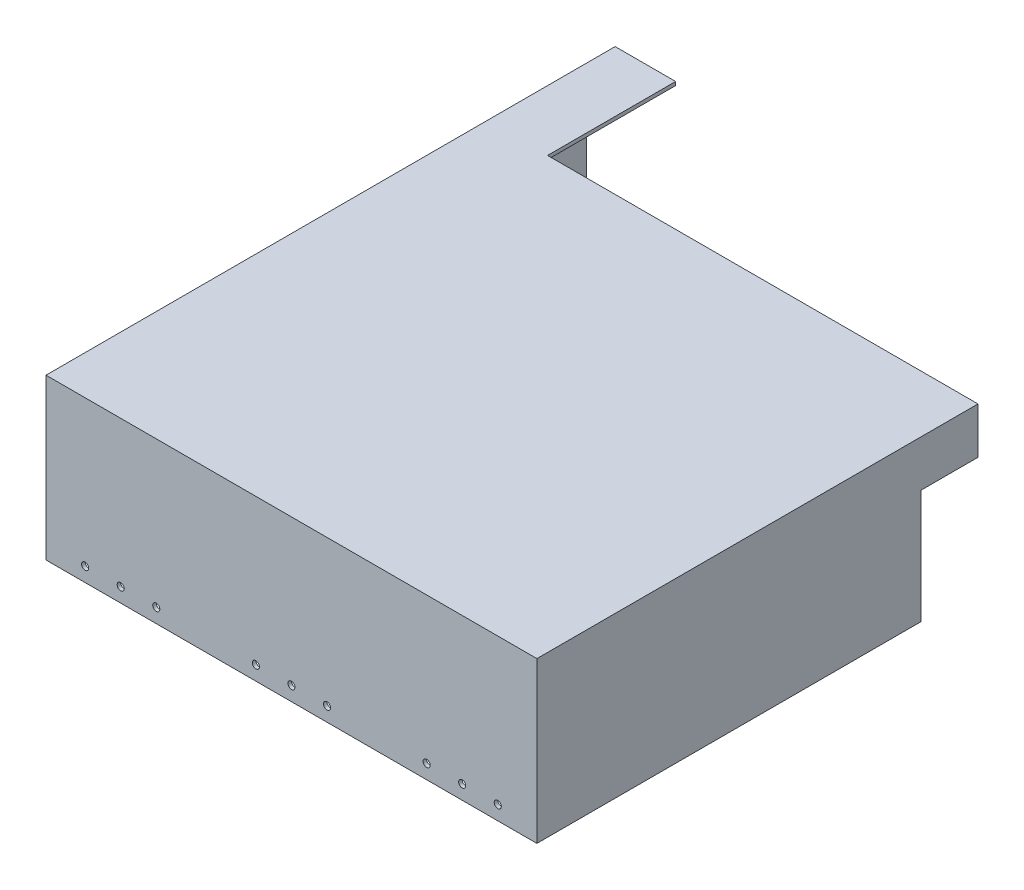
ISO-10303-21;
HEADER;
FILE_DESCRIPTION(('STEP AP214'),'2;1');
FILE_NAME('part.step','',(''),(''),'','','');
FILE_SCHEMA(('AUTOMOTIVE_DESIGN { 1 0 10303 214 1 1 1 1 }'));
ENDSEC;
DATA;
#1=APPLICATION_CONTEXT('core data for automotive mechanical design processes');
#2=APPLICATION_PROTOCOL_DEFINITION('international standard','automotive_design',2000,#1);
#3=PRODUCT_CONTEXT('',#1,'mechanical');
#4=PRODUCT('Part','Part','',(#3));
#5=PRODUCT_RELATED_PRODUCT_CATEGORY('part','',(#4));
#6=PRODUCT_DEFINITION_FORMATION('','',#4);
#7=PRODUCT_DEFINITION_CONTEXT('part definition',#1,'design');
#8=PRODUCT_DEFINITION('design','',#6,#7);
#9=PRODUCT_DEFINITION_SHAPE('','',#8);
#10=(LENGTH_UNIT() NAMED_UNIT(*) SI_UNIT(.MILLI.,.METRE.));
#11=(NAMED_UNIT(*) PLANE_ANGLE_UNIT() SI_UNIT($,.RADIAN.));
#12=(NAMED_UNIT(*) SI_UNIT($,.STERADIAN.) SOLID_ANGLE_UNIT());
#13=UNCERTAINTY_MEASURE_WITH_UNIT(LENGTH_MEASURE(1.E-05),#10,'distance_accuracy_value','');
#14=(GEOMETRIC_REPRESENTATION_CONTEXT(3) GLOBAL_UNCERTAINTY_ASSIGNED_CONTEXT((#13)) GLOBAL_UNIT_ASSIGNED_CONTEXT((#10,
#11,#12)) REPRESENTATION_CONTEXT('',''));
#15=CARTESIAN_POINT('',(0.,0.,0.));
#16=DIRECTION('',(0.,0.,1.));
#17=DIRECTION('',(1.,0.,0.));
#18=AXIS2_PLACEMENT_3D('',#15,#16,#17);
#19=CARTESIAN_POINT('',(3.175,0.,508.));
#20=DIRECTION('',(-1.,0.,0.));
#21=DIRECTION('',(0.,0.,1.));
#22=AXIS2_PLACEMENT_3D('',#19,#20,#21);
#23=PLANE('',#22);
#24=DIRECTION('',(0.,-1.,0.));
#25=VECTOR('',#24,1.);
#26=CARTESIAN_POINT('',(3.17499999999998,0.,28.575));
#27=LINE('',#26,#25);
#28=CARTESIAN_POINT('',(3.17499999999998,117.475,28.575));
#29=VERTEX_POINT('',#28);
#30=CARTESIAN_POINT('',(3.17499999999998,0.,28.575));
#31=VERTEX_POINT('',#30);
#32=EDGE_CURVE('E145',#29,#31,#27,.T.);
#33=ORIENTED_EDGE('',*,*,#32,.F.);
#34=DIRECTION('',(0.,0.,1.));
#35=VECTOR('',#34,1.);
#36=CARTESIAN_POINT('',(3.17499999999998,117.475,0.));
#37=LINE('',#36,#35);
#38=CARTESIAN_POINT('',(3.17499999999998,117.475,0.));
#39=VERTEX_POINT('',#38);
#40=EDGE_CURVE('E156',#39,#29,#37,.T.);
#41=ORIENTED_EDGE('',*,*,#40,.F.);
#42=DIRECTION('',(0.,1.,0.));
#43=VECTOR('',#42,1.);
#44=CARTESIAN_POINT('',(3.175,0.,0.));
#45=LINE('',#44,#43);
#46=CARTESIAN_POINT('',(3.175,139.7,0.));
#47=VERTEX_POINT('',#46);
#48=EDGE_CURVE('E190',#39,#47,#45,.T.);
#49=ORIENTED_EDGE('',*,*,#48,.T.);
#50=DIRECTION('',(0.,0.,-1.));
#51=VECTOR('',#50,1.);
#52=CARTESIAN_POINT('',(3.175,139.7,508.));
#53=LINE('',#52,#51);
#54=CARTESIAN_POINT('',(3.175,139.7,504.825));
#55=VERTEX_POINT('',#54);
#56=EDGE_CURVE('E163',#55,#47,#53,.T.);
#57=ORIENTED_EDGE('',*,*,#56,.F.);
#58=DIRECTION('',(0.,1.,0.));
#59=VECTOR('',#58,1.);
#60=CARTESIAN_POINT('',(3.175,0.,504.825));
#61=LINE('',#60,#59);
#62=CARTESIAN_POINT('',(3.175,0.,504.825));
#63=VERTEX_POINT('',#62);
#64=EDGE_CURVE('E194',#63,#55,#61,.T.);
#65=ORIENTED_EDGE('',*,*,#64,.F.);
#66=DIRECTION('',(0.,0.,-1.));
#67=VECTOR('',#66,1.);
#68=CARTESIAN_POINT('',(3.175,0.,508.));
#69=LINE('',#68,#67);
#70=EDGE_CURVE('E162',#63,#31,#69,.T.);
#71=ORIENTED_EDGE('',*,*,#70,.T.);
#72=EDGE_LOOP('',(#33,#41,#49,#57,#65,#71));
#73=FACE_BOUND('',#72,.T.);
#74=ADVANCED_FACE('F39',(#73),#23,.F.);
#75=CARTESIAN_POINT('',(3.175,139.7,508.));
#76=DIRECTION('',(0.,1.,0.));
#77=DIRECTION('',(0.,0.,1.));
#78=AXIS2_PLACEMENT_3D('',#75,#76,#77);
#79=PLANE('',#78);
#80=DIRECTION('',(1.,0.,0.));
#81=VECTOR('',#80,1.);
#82=CARTESIAN_POINT('',(3.175,139.7,0.));
#83=LINE('',#82,#81);
#84=CARTESIAN_POINT('',(53.975,139.7,0.));
#85=VERTEX_POINT('',#84);
#86=EDGE_CURVE('E187',#47,#85,#83,.T.);
#87=ORIENTED_EDGE('',*,*,#86,.T.);
#88=DIRECTION('',(0.,0.,1.));
#89=VECTOR('',#88,1.);
#90=CARTESIAN_POINT('',(53.9750000000001,139.7,508.));
#91=LINE('',#90,#89);
#92=CARTESIAN_POINT('',(53.975,139.7,114.3));
#93=VERTEX_POINT('',#92);
#94=EDGE_CURVE('E214',#85,#93,#91,.T.);
#95=ORIENTED_EDGE('',*,*,#94,.T.);
#96=DIRECTION('',(1.,0.,0.));
#97=VECTOR('',#96,1.);
#98=CARTESIAN_POINT('',(3.175,139.7,114.3));
#99=LINE('',#98,#97);
#100=CARTESIAN_POINT('',(434.975,139.7,114.3));
#101=VERTEX_POINT('',#100);
#102=EDGE_CURVE('E208',#93,#101,#99,.T.);
#103=ORIENTED_EDGE('',*,*,#102,.T.);
#104=DIRECTION('',(0.,0.,-1.));
#105=VECTOR('',#104,1.);
#106=CARTESIAN_POINT('',(434.975,139.7,508.));
#107=LINE('',#106,#105);
#108=CARTESIAN_POINT('',(434.975,139.7,504.825));
#109=VERTEX_POINT('',#108);
#110=EDGE_CURVE('E168',#109,#101,#107,.T.);
#111=ORIENTED_EDGE('',*,*,#110,.F.);
#112=DIRECTION('',(1.,0.,0.));
#113=VECTOR('',#112,1.);
#114=CARTESIAN_POINT('',(3.175,139.7,504.825));
#115=LINE('',#114,#113);
#116=EDGE_CURVE('E201',#55,#109,#115,.T.);
#117=ORIENTED_EDGE('',*,*,#116,.F.);
#118=ORIENTED_EDGE('',*,*,#56,.T.);
#119=EDGE_LOOP('',(#87,#95,#103,#111,#117,#118));
#120=FACE_BOUND('',#119,.T.);
#121=ADVANCED_FACE('F329',(#120),#79,.F.);
#122=CARTESIAN_POINT('',(434.975,139.7,508.));
#123=DIRECTION('',(1.,0.,0.));
#124=DIRECTION('',(0.,1.,0.));
#125=AXIS2_PLACEMENT_3D('',#122,#123,#124);
#126=PLANE('',#125);
#127=DIRECTION('',(0.,0.,-1.));
#128=VECTOR('',#127,1.);
#129=CARTESIAN_POINT('',(434.975,101.6,114.3));
#130=LINE('',#129,#128);
#131=CARTESIAN_POINT('',(434.975,101.6,165.1));
#132=VERTEX_POINT('',#131);
#133=CARTESIAN_POINT('',(434.975,101.6,114.3));
#134=VERTEX_POINT('',#133);
#135=EDGE_CURVE('E62',#132,#134,#130,.T.);
#136=ORIENTED_EDGE('',*,*,#135,.F.);
#137=DIRECTION('',(0.,1.,0.));
#138=VECTOR('',#137,1.);
#139=CARTESIAN_POINT('',(434.975,1.66620730681001E-13,165.1));
#140=LINE('',#139,#138);
#141=CARTESIAN_POINT('',(434.975,0.,165.1));
#142=VERTEX_POINT('',#141);
#143=EDGE_CURVE('E236',#142,#132,#140,.T.);
#144=ORIENTED_EDGE('',*,*,#143,.F.);
#145=DIRECTION('',(0.,0.,-1.));
#146=VECTOR('',#145,1.);
#147=CARTESIAN_POINT('',(434.975,0.,508.));
#148=LINE('',#147,#146);
#149=CARTESIAN_POINT('',(434.975,0.,504.825));
#150=VERTEX_POINT('',#149);
#151=EDGE_CURVE('E171',#150,#142,#148,.T.);
#152=ORIENTED_EDGE('',*,*,#151,.F.);
#153=DIRECTION('',(0.,-1.,0.));
#154=VECTOR('',#153,1.);
#155=CARTESIAN_POINT('',(434.975,139.7,504.825));
#156=LINE('',#155,#154);
#157=EDGE_CURVE('E203',#109,#150,#156,.T.);
#158=ORIENTED_EDGE('',*,*,#157,.F.);
#159=ORIENTED_EDGE('',*,*,#110,.T.);
#160=DIRECTION('',(0.,-1.,0.));
#161=VECTOR('',#160,1.);
#162=CARTESIAN_POINT('',(434.975,139.7,114.3));
#163=LINE('',#162,#161);
#164=EDGE_CURVE('E211',#101,#134,#163,.T.);
#165=ORIENTED_EDGE('',*,*,#164,.T.);
#166=EDGE_LOOP('',(#136,#144,#152,#158,#159,#165));
#167=FACE_BOUND('',#166,.T.);
#168=ADVANCED_FACE('F347',(#167),#126,.F.);
#169=CARTESIAN_POINT('',(0.,142.875,508.));
#170=DIRECTION('',(1.,0.,0.));
#171=DIRECTION('',(0.,1.,0.));
#172=AXIS2_PLACEMENT_3D('',#169,#170,#171);
#173=PLANE('',#172);
#174=DIRECTION('',(0.,-1.,0.));
#175=VECTOR('',#174,1.);
#176=CARTESIAN_POINT('',(0.,142.875,0.));
#177=LINE('',#176,#175);
#178=CARTESIAN_POINT('',(0.,142.875,0.));
#179=VERTEX_POINT('',#178);
#180=CARTESIAN_POINT('',(0.,117.475,0.));
#181=VERTEX_POINT('',#180);
#182=EDGE_CURVE('E192',#179,#181,#177,.T.);
#183=ORIENTED_EDGE('',*,*,#182,.T.);
#184=DIRECTION('',(0.,0.,-1.));
#185=VECTOR('',#184,1.);
#186=CARTESIAN_POINT('',(0.,117.475,0.));
#187=LINE('',#186,#185);
#188=CARTESIAN_POINT('',(0.,117.475,28.575));
#189=VERTEX_POINT('',#188);
#190=EDGE_CURVE('E54',#189,#181,#187,.T.);
#191=ORIENTED_EDGE('',*,*,#190,.F.);
#192=DIRECTION('',(0.,1.,0.));
#193=VECTOR('',#192,1.);
#194=CARTESIAN_POINT('',(0.,0.,28.575));
#195=LINE('',#194,#193);
#196=CARTESIAN_POINT('',(0.,0.,28.575));
#197=VERTEX_POINT('',#196);
#198=EDGE_CURVE('E143',#197,#189,#195,.T.);
#199=ORIENTED_EDGE('',*,*,#198,.F.);
#200=DIRECTION('',(0.,0.,-1.));
#201=VECTOR('',#200,1.);
#202=CARTESIAN_POINT('',(0.,0.,508.));
#203=LINE('',#202,#201);
#204=CARTESIAN_POINT('',(0.,0.,508.));
#205=VERTEX_POINT('',#204);
#206=EDGE_CURVE('E47',#205,#197,#203,.T.);
#207=ORIENTED_EDGE('',*,*,#206,.F.);
#208=DIRECTION('',(0.,-1.,0.));
#209=VECTOR('',#208,1.);
#210=CARTESIAN_POINT('',(0.,142.875,508.));
#211=LINE('',#210,#209);
#212=CARTESIAN_POINT('',(0.,142.875,508.));
#213=VERTEX_POINT('',#212);
#214=EDGE_CURVE('E186',#213,#205,#211,.T.);
#215=ORIENTED_EDGE('',*,*,#214,.F.);
#216=DIRECTION('',(0.,0.,-1.));
#217=VECTOR('',#216,1.);
#218=CARTESIAN_POINT('',(0.,142.875,508.));
#219=LINE('',#218,#217);
#220=EDGE_CURVE('E180',#213,#179,#219,.T.);
#221=ORIENTED_EDGE('',*,*,#220,.T.);
#222=EDGE_LOOP('',(#183,#191,#199,#207,#215,#221));
#223=FACE_BOUND('',#222,.T.);
#224=ADVANCED_FACE('F41',(#223),#173,.F.);
#225=CARTESIAN_POINT('',(434.975,0.,508.));
#226=DIRECTION('',(0.,1.,0.));
#227=DIRECTION('',(0.,0.,1.));
#228=AXIS2_PLACEMENT_3D('',#225,#226,#227);
#229=PLANE('',#228);
#230=ORIENTED_EDGE('',*,*,#206,.T.);
#231=DIRECTION('',(-1.,0.,0.));
#232=VECTOR('',#231,1.);
#233=CARTESIAN_POINT('',(438.151,0.,28.575));
#234=LINE('',#233,#232);
#235=EDGE_CURVE('E140',#31,#197,#234,.T.);
#236=ORIENTED_EDGE('',*,*,#235,.F.);
#237=ORIENTED_EDGE('',*,*,#70,.F.);
#238=DIRECTION('',(1.,0.,0.));
#239=VECTOR('',#238,1.);
#240=CARTESIAN_POINT('',(0.,0.,504.825));
#241=LINE('',#240,#239);
#242=EDGE_CURVE('E205',#63,#150,#241,.T.);
#243=ORIENTED_EDGE('',*,*,#242,.T.);
#244=ORIENTED_EDGE('',*,*,#151,.T.);
#245=DIRECTION('',(1.,0.,0.));
#246=VECTOR('',#245,1.);
#247=CARTESIAN_POINT('',(-0.000999999999973245,0.,165.1));
#248=LINE('',#247,#246);
#249=CARTESIAN_POINT('',(438.15,0.,165.1));
#250=VERTEX_POINT('',#249);
#251=EDGE_CURVE('E229',#142,#250,#248,.T.);
#252=ORIENTED_EDGE('',*,*,#251,.T.);
#253=DIRECTION('',(0.,0.,-1.));
#254=VECTOR('',#253,1.);
#255=CARTESIAN_POINT('',(438.15,0.,508.));
#256=LINE('',#255,#254);
#257=CARTESIAN_POINT('',(438.15,0.,508.));
#258=VERTEX_POINT('',#257);
#259=EDGE_CURVE('E174',#258,#250,#256,.T.);
#260=ORIENTED_EDGE('',*,*,#259,.F.);
#261=DIRECTION('',(1.,0.,0.));
#262=VECTOR('',#261,1.);
#263=CARTESIAN_POINT('',(0.,0.,508.));
#264=LINE('',#263,#262);
#265=EDGE_CURVE('E160',#205,#258,#264,.T.);
#266=ORIENTED_EDGE('',*,*,#265,.F.);
#267=EDGE_LOOP('',(#230,#236,#237,#243,#244,#252,#260,#266));
#268=FACE_BOUND('',#267,.T.);
#269=ADVANCED_FACE('F158',(#268),#229,.F.);
#270=CARTESIAN_POINT('',(438.15,0.,508.));
#271=DIRECTION('',(-1.,0.,0.));
#272=DIRECTION('',(0.,0.,1.));
#273=AXIS2_PLACEMENT_3D('',#270,#271,#272);
#274=PLANE('',#273);
#275=ORIENTED_EDGE('',*,*,#259,.T.);
#276=DIRECTION('',(0.,-1.,0.));
#277=VECTOR('',#276,1.);
#278=CARTESIAN_POINT('',(438.15,0.,165.1));
#279=LINE('',#278,#277);
#280=CARTESIAN_POINT('',(438.15,101.6,165.1));
#281=VERTEX_POINT('',#280);
#282=EDGE_CURVE('E239',#281,#250,#279,.T.);
#283=ORIENTED_EDGE('',*,*,#282,.F.);
#284=DIRECTION('',(0.,0.,1.));
#285=VECTOR('',#284,1.);
#286=CARTESIAN_POINT('',(438.15,101.6,114.3));
#287=LINE('',#286,#285);
#288=CARTESIAN_POINT('',(438.15,101.6,114.3));
#289=VERTEX_POINT('',#288);
#290=EDGE_CURVE('E233',#289,#281,#287,.T.);
#291=ORIENTED_EDGE('',*,*,#290,.F.);
#292=DIRECTION('',(0.,1.,0.));
#293=VECTOR('',#292,1.);
#294=CARTESIAN_POINT('',(438.15,0.,114.3));
#295=LINE('',#294,#293);
#296=CARTESIAN_POINT('',(438.15,142.875,114.3));
#297=VERTEX_POINT('',#296);
#298=EDGE_CURVE('E217',#289,#297,#295,.T.);
#299=ORIENTED_EDGE('',*,*,#298,.T.);
#300=DIRECTION('',(0.,0.,-1.));
#301=VECTOR('',#300,1.);
#302=CARTESIAN_POINT('',(438.15,142.875,508.));
#303=LINE('',#302,#301);
#304=CARTESIAN_POINT('',(438.15,142.875,508.));
#305=VERTEX_POINT('',#304);
#306=EDGE_CURVE('E177',#305,#297,#303,.T.);
#307=ORIENTED_EDGE('',*,*,#306,.F.);
#308=DIRECTION('',(0.,1.,0.));
#309=VECTOR('',#308,1.);
#310=CARTESIAN_POINT('',(438.15,0.,508.));
#311=LINE('',#310,#309);
#312=EDGE_CURVE('E196',#258,#305,#311,.T.);
#313=ORIENTED_EDGE('',*,*,#312,.F.);
#314=EDGE_LOOP('',(#275,#283,#291,#299,#307,#313));
#315=FACE_BOUND('',#314,.T.);
#316=ADVANCED_FACE('F353',(#315),#274,.F.);
#317=CARTESIAN_POINT('',(438.15,142.875,508.));
#318=DIRECTION('',(0.,-1.,0.));
#319=DIRECTION('',(1.,0.,0.));
#320=AXIS2_PLACEMENT_3D('',#317,#318,#319);
#321=PLANE('',#320);
#322=DIRECTION('',(1.,0.,0.));
#323=VECTOR('',#322,1.);
#324=CARTESIAN_POINT('',(53.975,142.875,114.3));
#325=LINE('',#324,#323);
#326=CARTESIAN_POINT('',(53.975,142.875,114.3));
#327=VERTEX_POINT('',#326);
#328=EDGE_CURVE('E220',#327,#297,#325,.T.);
#329=ORIENTED_EDGE('',*,*,#328,.F.);
#330=DIRECTION('',(0.,0.,1.));
#331=VECTOR('',#330,1.);
#332=CARTESIAN_POINT('',(53.975,142.875,0.));
#333=LINE('',#332,#331);
#334=CARTESIAN_POINT('',(53.975,142.875,0.));
#335=VERTEX_POINT('',#334);
#336=EDGE_CURVE('E224',#335,#327,#333,.T.);
#337=ORIENTED_EDGE('',*,*,#336,.F.);
#338=DIRECTION('',(-1.,0.,0.));
#339=VECTOR('',#338,1.);
#340=CARTESIAN_POINT('',(438.15,142.875,0.));
#341=LINE('',#340,#339);
#342=EDGE_CURVE('E184',#335,#179,#341,.T.);
#343=ORIENTED_EDGE('',*,*,#342,.T.);
#344=ORIENTED_EDGE('',*,*,#220,.F.);
#345=DIRECTION('',(-1.,0.,0.));
#346=VECTOR('',#345,1.);
#347=CARTESIAN_POINT('',(438.15,142.875,508.));
#348=LINE('',#347,#346);
#349=EDGE_CURVE('E183',#305,#213,#348,.T.);
#350=ORIENTED_EDGE('',*,*,#349,.F.);
#351=ORIENTED_EDGE('',*,*,#306,.T.);
#352=EDGE_LOOP('',(#329,#337,#343,#344,#350,#351));
#353=FACE_BOUND('',#352,.T.);
#354=ADVANCED_FACE('F340',(#353),#321,.F.);
#355=CARTESIAN_POINT('',(0.,0.,508.));
#356=DIRECTION('',(0.,0.,1.));
#357=DIRECTION('',(1.,0.,0.));
#358=AXIS2_PLACEMENT_3D('',#355,#356,#357);
#359=PLANE('',#358);
#360=CARTESIAN_POINT('',(403.225,12.7,508.));
#361=DIRECTION('',(0.,0.,1.));
#362=DIRECTION('',(-1.,0.,0.));
#363=AXIS2_PLACEMENT_3D('',#360,#361,#362);
#364=CIRCLE('',#363,3.17499999999997);
#365=CARTESIAN_POINT('',(400.05,12.7,508.));
#366=VERTEX_POINT('',#365);
#367=EDGE_CURVE('E257',#366,#366,#364,.T.);
#368=ORIENTED_EDGE('',*,*,#367,.F.);
#369=EDGE_LOOP('',(#368));
#370=FACE_BOUND('',#369,.T.);
#371=CARTESIAN_POINT('',(371.475,12.7,508.));
#372=DIRECTION('',(0.,0.,1.));
#373=DIRECTION('',(-1.,0.,0.));
#374=AXIS2_PLACEMENT_3D('',#371,#372,#373);
#375=CIRCLE('',#374,3.17499999999992);
#376=CARTESIAN_POINT('',(368.3,12.7,508.));
#377=VERTEX_POINT('',#376);
#378=EDGE_CURVE('E264',#377,#377,#375,.T.);
#379=ORIENTED_EDGE('',*,*,#378,.F.);
#380=EDGE_LOOP('',(#379));
#381=FACE_BOUND('',#380,.T.);
#382=CARTESIAN_POINT('',(339.725,12.7,508.));
#383=DIRECTION('',(0.,0.,1.));
#384=DIRECTION('',(-1.,0.,0.));
#385=AXIS2_PLACEMENT_3D('',#382,#383,#384);
#386=CIRCLE('',#385,3.17500000000002);
#387=CARTESIAN_POINT('',(336.55,12.7,508.));
#388=VERTEX_POINT('',#387);
#389=EDGE_CURVE('E270',#388,#388,#386,.T.);
#390=ORIENTED_EDGE('',*,*,#389,.F.);
#391=EDGE_LOOP('',(#390));
#392=FACE_BOUND('',#391,.T.);
#393=CARTESIAN_POINT('',(250.825,12.7,508.));
#394=DIRECTION('',(0.,0.,1.));
#395=DIRECTION('',(-1.,0.,0.));
#396=AXIS2_PLACEMENT_3D('',#393,#394,#395);
#397=CIRCLE('',#396,3.175);
#398=CARTESIAN_POINT('',(247.65,12.7,508.));
#399=VERTEX_POINT('',#398);
#400=EDGE_CURVE('E276',#399,#399,#397,.T.);
#401=ORIENTED_EDGE('',*,*,#400,.F.);
#402=EDGE_LOOP('',(#401));
#403=FACE_BOUND('',#402,.T.);
#404=CARTESIAN_POINT('',(187.325,12.7,508.));
#405=DIRECTION('',(0.,0.,1.));
#406=DIRECTION('',(1.,0.,0.));
#407=AXIS2_PLACEMENT_3D('',#404,#405,#406);
#408=CIRCLE('',#407,3.175);
#409=CARTESIAN_POINT('',(190.5,12.7,508.));
#410=VERTEX_POINT('',#409);
#411=EDGE_CURVE('E256',#410,#410,#408,.T.);
#412=ORIENTED_EDGE('',*,*,#411,.F.);
#413=EDGE_LOOP('',(#412));
#414=FACE_BOUND('',#413,.T.);
#415=CARTESIAN_POINT('',(34.925,12.7,508.));
#416=DIRECTION('',(0.,0.,1.));
#417=DIRECTION('',(1.,0.,0.));
#418=AXIS2_PLACEMENT_3D('',#415,#416,#417);
#419=CIRCLE('',#418,3.175);
#420=CARTESIAN_POINT('',(38.1,12.7,508.));
#421=VERTEX_POINT('',#420);
#422=EDGE_CURVE('E282',#421,#421,#419,.T.);
#423=ORIENTED_EDGE('',*,*,#422,.F.);
#424=EDGE_LOOP('',(#423));
#425=FACE_BOUND('',#424,.T.);
#426=CARTESIAN_POINT('',(66.675,12.7,508.));
#427=DIRECTION('',(0.,0.,1.));
#428=DIRECTION('',(1.,0.,0.));
#429=AXIS2_PLACEMENT_3D('',#426,#427,#428);
#430=CIRCLE('',#429,3.175);
#431=CARTESIAN_POINT('',(69.85,12.7,508.));
#432=VERTEX_POINT('',#431);
#433=EDGE_CURVE('E289',#432,#432,#430,.T.);
#434=ORIENTED_EDGE('',*,*,#433,.F.);
#435=EDGE_LOOP('',(#434));
#436=FACE_BOUND('',#435,.T.);
#437=CARTESIAN_POINT('',(98.425,12.7,508.));
#438=DIRECTION('',(0.,0.,1.));
#439=DIRECTION('',(1.,0.,0.));
#440=AXIS2_PLACEMENT_3D('',#437,#438,#439);
#441=CIRCLE('',#440,3.175);
#442=CARTESIAN_POINT('',(101.6,12.7,508.));
#443=VERTEX_POINT('',#442);
#444=EDGE_CURVE('E294',#443,#443,#441,.T.);
#445=ORIENTED_EDGE('',*,*,#444,.F.);
#446=EDGE_LOOP('',(#445));
#447=FACE_BOUND('',#446,.T.);
#448=CARTESIAN_POINT('',(219.075,12.7,508.));
#449=DIRECTION('',(0.,0.,1.));
#450=DIRECTION('',(1.,0.,0.));
#451=AXIS2_PLACEMENT_3D('',#448,#449,#450);
#452=CIRCLE('',#451,3.175);
#453=CARTESIAN_POINT('',(222.25,12.7,508.));
#454=VERTEX_POINT('',#453);
#455=EDGE_CURVE('E253',#454,#454,#452,.T.);
#456=ORIENTED_EDGE('',*,*,#455,.F.);
#457=EDGE_LOOP('',(#456));
#458=FACE_BOUND('',#457,.T.);
#459=ORIENTED_EDGE('',*,*,#214,.T.);
#460=ORIENTED_EDGE('',*,*,#265,.T.);
#461=ORIENTED_EDGE('',*,*,#312,.T.);
#462=ORIENTED_EDGE('',*,*,#349,.T.);
#463=EDGE_LOOP('',(#459,#460,#461,#462));
#464=FACE_BOUND('',#463,.T.);
#465=ADVANCED_FACE('F356',(#370,#381,#392,#403,#414,#425,#436,#447,#458,#464),#359,.T.);
#466=CARTESIAN_POINT('',(0.,0.,0.));
#467=DIRECTION('',(0.,0.,1.));
#468=DIRECTION('',(1.,0.,0.));
#469=AXIS2_PLACEMENT_3D('',#466,#467,#468);
#470=PLANE('',#469);
#471=ORIENTED_EDGE('',*,*,#48,.F.);
#472=DIRECTION('',(-1.,0.,0.));
#473=VECTOR('',#472,1.);
#474=CARTESIAN_POINT('',(438.151,117.475,0.));
#475=LINE('',#474,#473);
#476=EDGE_CURVE('E230',#39,#181,#475,.T.);
#477=ORIENTED_EDGE('',*,*,#476,.T.);
#478=ORIENTED_EDGE('',*,*,#182,.F.);
#479=ORIENTED_EDGE('',*,*,#342,.F.);
#480=DIRECTION('',(0.,-1.,0.));
#481=VECTOR('',#480,1.);
#482=CARTESIAN_POINT('',(53.975,0.,0.));
#483=LINE('',#482,#481);
#484=EDGE_CURVE('E11',#335,#85,#483,.T.);
#485=ORIENTED_EDGE('',*,*,#484,.T.);
#486=ORIENTED_EDGE('',*,*,#86,.F.);
#487=EDGE_LOOP('',(#471,#477,#478,#479,#485,#486));
#488=FACE_BOUND('',#487,.T.);
#489=ADVANCED_FACE('F312',(#488),#470,.F.);
#490=CARTESIAN_POINT('',(0.,0.,504.825));
#491=DIRECTION('',(0.,0.,1.));
#492=DIRECTION('',(1.,0.,0.));
#493=AXIS2_PLACEMENT_3D('',#490,#491,#492);
#494=PLANE('',#493);
#495=CARTESIAN_POINT('',(403.225,12.7,504.825));
#496=DIRECTION('',(0.,0.,1.));
#497=DIRECTION('',(1.,0.,0.));
#498=AXIS2_PLACEMENT_3D('',#495,#496,#497);
#499=CIRCLE('',#498,3.17499999999997);
#500=CARTESIAN_POINT('',(406.4,12.7,504.825));
#501=VERTEX_POINT('',#500);
#502=EDGE_CURVE('E261',#501,#501,#499,.F.);
#503=ORIENTED_EDGE('',*,*,#502,.F.);
#504=EDGE_LOOP('',(#503));
#505=FACE_BOUND('',#504,.T.);
#506=CARTESIAN_POINT('',(371.475,12.7,504.825));
#507=DIRECTION('',(0.,0.,1.));
#508=DIRECTION('',(1.,0.,0.));
#509=AXIS2_PLACEMENT_3D('',#506,#507,#508);
#510=CIRCLE('',#509,3.17499999999992);
#511=CARTESIAN_POINT('',(374.65,12.7,504.825));
#512=VERTEX_POINT('',#511);
#513=EDGE_CURVE('E260',#512,#512,#510,.F.);
#514=ORIENTED_EDGE('',*,*,#513,.F.);
#515=EDGE_LOOP('',(#514));
#516=FACE_BOUND('',#515,.T.);
#517=CARTESIAN_POINT('',(339.725,12.7,504.825));
#518=DIRECTION('',(0.,0.,1.));
#519=DIRECTION('',(1.,0.,0.));
#520=AXIS2_PLACEMENT_3D('',#517,#518,#519);
#521=CIRCLE('',#520,3.17500000000002);
#522=CARTESIAN_POINT('',(342.9,12.7,504.825));
#523=VERTEX_POINT('',#522);
#524=EDGE_CURVE('E267',#523,#523,#521,.F.);
#525=ORIENTED_EDGE('',*,*,#524,.F.);
#526=EDGE_LOOP('',(#525));
#527=FACE_BOUND('',#526,.T.);
#528=CARTESIAN_POINT('',(250.825,12.7,504.825));
#529=DIRECTION('',(0.,0.,1.));
#530=DIRECTION('',(1.,0.,0.));
#531=AXIS2_PLACEMENT_3D('',#528,#529,#530);
#532=CIRCLE('',#531,3.175);
#533=CARTESIAN_POINT('',(254.,12.7,504.825));
#534=VERTEX_POINT('',#533);
#535=EDGE_CURVE('E273',#534,#534,#532,.F.);
#536=ORIENTED_EDGE('',*,*,#535,.F.);
#537=EDGE_LOOP('',(#536));
#538=FACE_BOUND('',#537,.T.);
#539=CARTESIAN_POINT('',(187.325,12.7,504.825));
#540=DIRECTION('',(0.,0.,1.));
#541=DIRECTION('',(1.,0.,0.));
#542=AXIS2_PLACEMENT_3D('',#539,#540,#541);
#543=CIRCLE('',#542,3.175);
#544=CARTESIAN_POINT('',(190.5,12.7,504.825));
#545=VERTEX_POINT('',#544);
#546=EDGE_CURVE('E285',#545,#545,#543,.F.);
#547=ORIENTED_EDGE('',*,*,#546,.F.);
#548=EDGE_LOOP('',(#547));
#549=FACE_BOUND('',#548,.T.);
#550=CARTESIAN_POINT('',(34.925,12.7,504.825));
#551=DIRECTION('',(0.,0.,1.));
#552=DIRECTION('',(1.,0.,0.));
#553=AXIS2_PLACEMENT_3D('',#550,#551,#552);
#554=CIRCLE('',#553,3.175);
#555=CARTESIAN_POINT('',(38.1,12.7,504.825));
#556=VERTEX_POINT('',#555);
#557=EDGE_CURVE('E286',#556,#556,#554,.F.);
#558=ORIENTED_EDGE('',*,*,#557,.F.);
#559=EDGE_LOOP('',(#558));
#560=FACE_BOUND('',#559,.T.);
#561=CARTESIAN_POINT('',(66.675,12.7,504.825));
#562=DIRECTION('',(0.,0.,1.));
#563=DIRECTION('',(1.,0.,0.));
#564=AXIS2_PLACEMENT_3D('',#561,#562,#563);
#565=CIRCLE('',#564,3.175);
#566=CARTESIAN_POINT('',(69.85,12.7,504.825));
#567=VERTEX_POINT('',#566);
#568=EDGE_CURVE('E297',#567,#567,#565,.F.);
#569=ORIENTED_EDGE('',*,*,#568,.F.);
#570=EDGE_LOOP('',(#569));
#571=FACE_BOUND('',#570,.T.);
#572=CARTESIAN_POINT('',(98.425,12.7,504.825));
#573=DIRECTION('',(0.,0.,1.));
#574=DIRECTION('',(1.,0.,0.));
#575=AXIS2_PLACEMENT_3D('',#572,#573,#574);
#576=CIRCLE('',#575,3.175);
#577=CARTESIAN_POINT('',(101.6,12.7,504.825));
#578=VERTEX_POINT('',#577);
#579=EDGE_CURVE('E279',#578,#578,#576,.F.);
#580=ORIENTED_EDGE('',*,*,#579,.F.);
#581=EDGE_LOOP('',(#580));
#582=FACE_BOUND('',#581,.T.);
#583=CARTESIAN_POINT('',(219.075,12.7,504.825));
#584=DIRECTION('',(0.,0.,1.));
#585=DIRECTION('',(1.,0.,0.));
#586=AXIS2_PLACEMENT_3D('',#583,#584,#585);
#587=CIRCLE('',#586,3.175);
#588=CARTESIAN_POINT('',(222.25,12.7,504.825));
#589=VERTEX_POINT('',#588);
#590=EDGE_CURVE('E250',#589,#589,#587,.F.);
#591=ORIENTED_EDGE('',*,*,#590,.F.);
#592=EDGE_LOOP('',(#591));
#593=FACE_BOUND('',#592,.T.);
#594=ORIENTED_EDGE('',*,*,#242,.F.);
#595=ORIENTED_EDGE('',*,*,#64,.T.);
#596=ORIENTED_EDGE('',*,*,#116,.T.);
#597=ORIENTED_EDGE('',*,*,#157,.T.);
#598=EDGE_LOOP('',(#594,#595,#596,#597));
#599=FACE_BOUND('',#598,.T.);
#600=ADVANCED_FACE('F308',(#505,#516,#527,#538,#549,#560,#571,#582,#593,#599),#494,.F.);
#601=CARTESIAN_POINT('',(53.975,0.,114.3));
#602=DIRECTION('',(0.,0.,1.));
#603=DIRECTION('',(1.,0.,0.));
#604=AXIS2_PLACEMENT_3D('',#601,#602,#603);
#605=PLANE('',#604);
#606=ORIENTED_EDGE('',*,*,#298,.F.);
#607=DIRECTION('',(1.,0.,0.));
#608=VECTOR('',#607,1.);
#609=CARTESIAN_POINT('',(-0.000999999999973245,101.6,114.3));
#610=LINE('',#609,#608);
#611=EDGE_CURVE('E227',#134,#289,#610,.T.);
#612=ORIENTED_EDGE('',*,*,#611,.F.);
#613=ORIENTED_EDGE('',*,*,#164,.F.);
#614=ORIENTED_EDGE('',*,*,#102,.F.);
#615=DIRECTION('',(0.,1.,0.));
#616=VECTOR('',#615,1.);
#617=CARTESIAN_POINT('',(53.975,0.,114.3));
#618=LINE('',#617,#616);
#619=EDGE_CURVE('E218',#93,#327,#618,.T.);
#620=ORIENTED_EDGE('',*,*,#619,.T.);
#621=ORIENTED_EDGE('',*,*,#328,.T.);
#622=EDGE_LOOP('',(#606,#612,#613,#614,#620,#621));
#623=FACE_BOUND('',#622,.T.);
#624=ADVANCED_FACE('F311',(#623),#605,.F.);
#625=CARTESIAN_POINT('',(53.975,0.,0.));
#626=DIRECTION('',(-1.,0.,0.));
#627=DIRECTION('',(0.,0.,1.));
#628=AXIS2_PLACEMENT_3D('',#625,#626,#627);
#629=PLANE('',#628);
#630=ORIENTED_EDGE('',*,*,#484,.F.);
#631=ORIENTED_EDGE('',*,*,#336,.T.);
#632=ORIENTED_EDGE('',*,*,#619,.F.);
#633=ORIENTED_EDGE('',*,*,#94,.F.);
#634=EDGE_LOOP('',(#630,#631,#632,#633));
#635=FACE_BOUND('',#634,.T.);
#636=ADVANCED_FACE('F336',(#635),#629,.F.);
#637=CARTESIAN_POINT('',(-0.000999999999973245,0.,165.1));
#638=DIRECTION('',(0.,0.,1.));
#639=DIRECTION('',(1.,0.,0.));
#640=AXIS2_PLACEMENT_3D('',#637,#638,#639);
#641=PLANE('',#640);
#642=ORIENTED_EDGE('',*,*,#143,.T.);
#643=DIRECTION('',(1.,0.,0.));
#644=VECTOR('',#643,1.);
#645=CARTESIAN_POINT('',(-0.000999999999973245,101.6,165.1));
#646=LINE('',#645,#644);
#647=EDGE_CURVE('E231',#132,#281,#646,.T.);
#648=ORIENTED_EDGE('',*,*,#647,.T.);
#649=ORIENTED_EDGE('',*,*,#282,.T.);
#650=ORIENTED_EDGE('',*,*,#251,.F.);
#651=EDGE_LOOP('',(#642,#648,#649,#650));
#652=FACE_BOUND('',#651,.T.);
#653=ADVANCED_FACE('F368',(#652),#641,.F.);
#654=CARTESIAN_POINT('',(-0.000999999999973245,101.6,114.3));
#655=DIRECTION('',(0.,1.,0.));
#656=DIRECTION('',(0.,0.,1.));
#657=AXIS2_PLACEMENT_3D('',#654,#655,#656);
#658=PLANE('',#657);
#659=ORIENTED_EDGE('',*,*,#135,.T.);
#660=ORIENTED_EDGE('',*,*,#611,.T.);
#661=ORIENTED_EDGE('',*,*,#290,.T.);
#662=ORIENTED_EDGE('',*,*,#647,.F.);
#663=EDGE_LOOP('',(#659,#660,#661,#662));
#664=FACE_BOUND('',#663,.T.);
#665=ADVANCED_FACE('F359',(#664),#658,.F.);
#666=CARTESIAN_POINT('',(438.151,117.475,0.));
#667=DIRECTION('',(0.,1.,0.));
#668=DIRECTION('',(-1.,0.,0.));
#669=AXIS2_PLACEMENT_3D('',#666,#667,#668);
#670=PLANE('',#669);
#671=ORIENTED_EDGE('',*,*,#40,.T.);
#672=DIRECTION('',(-1.,0.,0.));
#673=VECTOR('',#672,1.);
#674=CARTESIAN_POINT('',(438.151,117.475,28.575));
#675=LINE('',#674,#673);
#676=EDGE_CURVE('E150',#29,#189,#675,.T.);
#677=ORIENTED_EDGE('',*,*,#676,.T.);
#678=ORIENTED_EDGE('',*,*,#190,.T.);
#679=ORIENTED_EDGE('',*,*,#476,.F.);
#680=EDGE_LOOP('',(#671,#677,#678,#679));
#681=FACE_BOUND('',#680,.T.);
#682=ADVANCED_FACE('F357',(#681),#670,.F.);
#683=CARTESIAN_POINT('',(438.151,0.,28.575));
#684=DIRECTION('',(0.,0.,1.));
#685=DIRECTION('',(1.,0.,0.));
#686=AXIS2_PLACEMENT_3D('',#683,#684,#685);
#687=PLANE('',#686);
#688=ORIENTED_EDGE('',*,*,#32,.T.);
#689=ORIENTED_EDGE('',*,*,#235,.T.);
#690=ORIENTED_EDGE('',*,*,#198,.T.);
#691=ORIENTED_EDGE('',*,*,#676,.F.);
#692=EDGE_LOOP('',(#688,#689,#690,#691));
#693=FACE_BOUND('',#692,.T.);
#694=ADVANCED_FACE('F142',(#693),#687,.F.);
#695=CARTESIAN_POINT('',(219.075,12.7,495.844743878931));
#696=DIRECTION('',(0.,0.,1.));
#697=DIRECTION('',(1.,0.,0.));
#698=AXIS2_PLACEMENT_3D('',#695,#696,#697);
#699=CYLINDRICAL_SURFACE('',#698,3.175);
#700=ORIENTED_EDGE('',*,*,#590,.T.);
#701=EDGE_LOOP('',(#700));
#702=FACE_BOUND('',#701,.T.);
#703=ORIENTED_EDGE('',*,*,#455,.T.);
#704=EDGE_LOOP('',(#703));
#705=FACE_BOUND('',#704,.T.);
#706=ADVANCED_FACE('F365',(#702,#705),#699,.F.);
#707=CARTESIAN_POINT('',(98.425,12.7,495.844743878931));
#708=DIRECTION('',(0.,0.,1.));
#709=DIRECTION('',(1.,0.,0.));
#710=AXIS2_PLACEMENT_3D('',#707,#708,#709);
#711=CYLINDRICAL_SURFACE('',#710,3.175);
#712=ORIENTED_EDGE('',*,*,#579,.T.);
#713=EDGE_LOOP('',(#712));
#714=FACE_BOUND('',#713,.T.);
#715=ORIENTED_EDGE('',*,*,#444,.T.);
#716=EDGE_LOOP('',(#715));
#717=FACE_BOUND('',#716,.T.);
#718=ADVANCED_FACE('F425',(#714,#717),#711,.F.);
#719=CARTESIAN_POINT('',(66.675,12.7,495.844743878931));
#720=DIRECTION('',(0.,0.,1.));
#721=DIRECTION('',(1.,0.,0.));
#722=AXIS2_PLACEMENT_3D('',#719,#720,#721);
#723=CYLINDRICAL_SURFACE('',#722,3.175);
#724=ORIENTED_EDGE('',*,*,#568,.T.);
#725=EDGE_LOOP('',(#724));
#726=FACE_BOUND('',#725,.T.);
#727=ORIENTED_EDGE('',*,*,#433,.T.);
#728=EDGE_LOOP('',(#727));
#729=FACE_BOUND('',#728,.T.);
#730=ADVANCED_FACE('F305',(#726,#729),#723,.F.);
#731=CARTESIAN_POINT('',(34.925,12.7,495.844743878931));
#732=DIRECTION('',(0.,0.,1.));
#733=DIRECTION('',(1.,0.,0.));
#734=AXIS2_PLACEMENT_3D('',#731,#732,#733);
#735=CYLINDRICAL_SURFACE('',#734,3.175);
#736=ORIENTED_EDGE('',*,*,#557,.T.);
#737=EDGE_LOOP('',(#736));
#738=FACE_BOUND('',#737,.T.);
#739=ORIENTED_EDGE('',*,*,#422,.T.);
#740=EDGE_LOOP('',(#739));
#741=FACE_BOUND('',#740,.T.);
#742=ADVANCED_FACE('F443',(#738,#741),#735,.F.);
#743=CARTESIAN_POINT('',(187.325,12.7,495.844743878931));
#744=DIRECTION('',(0.,0.,1.));
#745=DIRECTION('',(1.,0.,0.));
#746=AXIS2_PLACEMENT_3D('',#743,#744,#745);
#747=CYLINDRICAL_SURFACE('',#746,3.175);
#748=ORIENTED_EDGE('',*,*,#546,.T.);
#749=EDGE_LOOP('',(#748));
#750=FACE_BOUND('',#749,.T.);
#751=ORIENTED_EDGE('',*,*,#411,.T.);
#752=EDGE_LOOP('',(#751));
#753=FACE_BOUND('',#752,.T.);
#754=ADVANCED_FACE('F452',(#750,#753),#747,.F.);
#755=CARTESIAN_POINT('',(250.825,12.7,495.844743878931));
#756=DIRECTION('',(0.,0.,1.));
#757=DIRECTION('',(1.,0.,0.));
#758=AXIS2_PLACEMENT_3D('',#755,#756,#757);
#759=CYLINDRICAL_SURFACE('',#758,3.175);
#760=ORIENTED_EDGE('',*,*,#535,.T.);
#761=EDGE_LOOP('',(#760));
#762=FACE_BOUND('',#761,.T.);
#763=ORIENTED_EDGE('',*,*,#400,.T.);
#764=EDGE_LOOP('',(#763));
#765=FACE_BOUND('',#764,.T.);
#766=ADVANCED_FACE('F462',(#762,#765),#759,.F.);
#767=CARTESIAN_POINT('',(339.725,12.7,495.844743878931));
#768=DIRECTION('',(0.,0.,1.));
#769=DIRECTION('',(1.,0.,0.));
#770=AXIS2_PLACEMENT_3D('',#767,#768,#769);
#771=CYLINDRICAL_SURFACE('',#770,3.17500000000002);
#772=ORIENTED_EDGE('',*,*,#524,.T.);
#773=EDGE_LOOP('',(#772));
#774=FACE_BOUND('',#773,.T.);
#775=ORIENTED_EDGE('',*,*,#389,.T.);
#776=EDGE_LOOP('',(#775));
#777=FACE_BOUND('',#776,.T.);
#778=ADVANCED_FACE('F472',(#774,#777),#771,.F.);
#779=CARTESIAN_POINT('',(371.475,12.7,495.844743878931));
#780=DIRECTION('',(0.,0.,1.));
#781=DIRECTION('',(1.,0.,0.));
#782=AXIS2_PLACEMENT_3D('',#779,#780,#781);
#783=CYLINDRICAL_SURFACE('',#782,3.17499999999992);
#784=ORIENTED_EDGE('',*,*,#513,.T.);
#785=EDGE_LOOP('',(#784));
#786=FACE_BOUND('',#785,.T.);
#787=ORIENTED_EDGE('',*,*,#378,.T.);
#788=EDGE_LOOP('',(#787));
#789=FACE_BOUND('',#788,.T.);
#790=ADVANCED_FACE('F482',(#786,#789),#783,.F.);
#791=CARTESIAN_POINT('',(403.225,12.7,495.844743878931));
#792=DIRECTION('',(0.,0.,1.));
#793=DIRECTION('',(1.,0.,0.));
#794=AXIS2_PLACEMENT_3D('',#791,#792,#793);
#795=CYLINDRICAL_SURFACE('',#794,3.17499999999997);
#796=ORIENTED_EDGE('',*,*,#502,.T.);
#797=EDGE_LOOP('',(#796));
#798=FACE_BOUND('',#797,.T.);
#799=ORIENTED_EDGE('',*,*,#367,.T.);
#800=EDGE_LOOP('',(#799));
#801=FACE_BOUND('',#800,.T.);
#802=ADVANCED_FACE('F492',(#798,#801),#795,.F.);
#803=CLOSED_SHELL('',(#74,#121,#168,#224,#269,#316,#354,#465,#489,#600,#624,#636,#653,#665,#682,
#694,#706,#718,#730,#742,#754,#766,#778,#790,#802));
#804=MANIFOLD_SOLID_BREP('B2',#803);
#805=ADVANCED_BREP_SHAPE_REPRESENTATION('',(#18,#804),#14);
#806=SHAPE_DEFINITION_REPRESENTATION(#9,#805);
ENDSEC;
END-ISO-10303-21;
